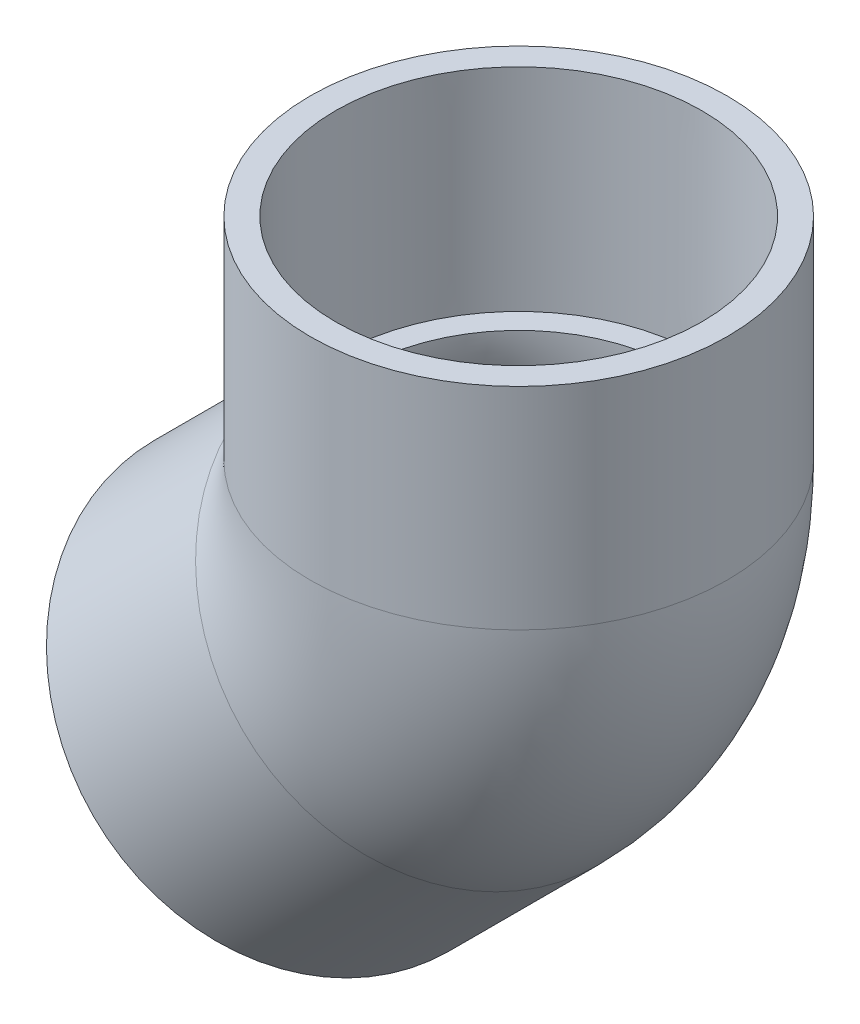
ISO-10303-21;
HEADER;
FILE_DESCRIPTION(('STEP AP214'),'2;1');
FILE_NAME('part.step','',(''),(''),'','','');
FILE_SCHEMA(('AUTOMOTIVE_DESIGN { 1 0 10303 214 1 1 1 1 }'));
ENDSEC;
DATA;
#1=APPLICATION_CONTEXT('core data for automotive mechanical design processes');
#2=APPLICATION_PROTOCOL_DEFINITION('international standard','automotive_design',2000,#1);
#3=PRODUCT_CONTEXT('',#1,'mechanical');
#4=PRODUCT('Part','Part','',(#3));
#5=PRODUCT_RELATED_PRODUCT_CATEGORY('part','',(#4));
#6=PRODUCT_DEFINITION_FORMATION('','',#4);
#7=PRODUCT_DEFINITION_CONTEXT('part definition',#1,'design');
#8=PRODUCT_DEFINITION('design','',#6,#7);
#9=PRODUCT_DEFINITION_SHAPE('','',#8);
#10=(LENGTH_UNIT() NAMED_UNIT(*) SI_UNIT(.MILLI.,.METRE.));
#11=(NAMED_UNIT(*) PLANE_ANGLE_UNIT() SI_UNIT($,.RADIAN.));
#12=(NAMED_UNIT(*) SI_UNIT($,.STERADIAN.) SOLID_ANGLE_UNIT());
#13=UNCERTAINTY_MEASURE_WITH_UNIT(LENGTH_MEASURE(1.E-05),#10,'distance_accuracy_value','');
#14=(GEOMETRIC_REPRESENTATION_CONTEXT(3) GLOBAL_UNCERTAINTY_ASSIGNED_CONTEXT((#13)) GLOBAL_UNIT_ASSIGNED_CONTEXT((#10,
#11,#12)) REPRESENTATION_CONTEXT('',''));
#15=CARTESIAN_POINT('',(0.,0.,0.));
#16=DIRECTION('',(0.,0.,1.));
#17=DIRECTION('',(1.,0.,0.));
#18=AXIS2_PLACEMENT_3D('',#15,#16,#17);
#19=CARTESIAN_POINT('',(-11.50595315512,-60.3360958134333,0.));
#20=DIRECTION('',(-0.707106781186549,-0.707106781186546,0.));
#21=DIRECTION('',(0.707106781186546,-0.707106781186549,0.));
#22=AXIS2_PLACEMENT_3D('',#19,#20,#21);
#23=PLANE('',#22);
#24=CARTESIAN_POINT('',(-35.9210244842767,-35.9210244842766,0.));
#25=DIRECTION('',(-0.707106781186549,-0.707106781186546,0.));
#26=DIRECTION('',(0.707106781186546,-0.707106781186549,0.));
#27=AXIS2_PLACEMENT_3D('',#24,#25,#26);
#28=CIRCLE('',#27,34.528125);
#29=CARTESIAN_POINT('',(-11.50595315512,-60.3360958134333,0.));
#30=VERTEX_POINT('',#29);
#31=EDGE_CURVE('E62',#30,#30,#28,.T.);
#32=ORIENTED_EDGE('',*,*,#31,.T.);
#33=EDGE_LOOP('',(#32));
#34=FACE_BOUND('',#33,.T.);
#35=CARTESIAN_POINT('',(-35.9210244842767,-35.9210244842766,0.));
#36=DIRECTION('',(-0.707106781186549,-0.707106781186546,0.));
#37=DIRECTION('',(0.707106781186546,-0.707106781186549,0.));
#38=AXIS2_PLACEMENT_3D('',#35,#36,#37);
#39=CIRCLE('',#38,30.3149);
#40=CARTESIAN_POINT('',(-14.4851531232846,-57.3568958452686,0.));
#41=VERTEX_POINT('',#40);
#42=EDGE_CURVE('E46',#41,#41,#39,.T.);
#43=ORIENTED_EDGE('',*,*,#42,.F.);
#44=EDGE_LOOP('',(#43));
#45=FACE_BOUND('',#44,.T.);
#46=ADVANCED_FACE('F39',(#34,#45),#23,.T.);
#47=CARTESIAN_POINT('',(-11.2253201513365,-11.2253201513364,0.));
#48=DIRECTION('',(-0.707106781186549,-0.707106781186546,0.));
#49=DIRECTION('',(0.707106781186546,-0.707106781186549,0.));
#50=AXIS2_PLACEMENT_3D('',#47,#48,#49);
#51=CONICAL_SURFACE('',#50,30.0863,0.00654536107227494);
#52=ORIENTED_EDGE('',*,*,#42,.T.);
#53=EDGE_LOOP('',(#52));
#54=FACE_BOUND('',#53,.T.);
#55=CARTESIAN_POINT('',(-11.2253201513365,-11.2253201513364,0.));
#56=DIRECTION('',(-0.707106781186549,-0.707106781186546,0.));
#57=DIRECTION('',(0.707106781186546,-0.707106781186549,0.));
#58=AXIS2_PLACEMENT_3D('',#55,#56,#57);
#59=CIRCLE('',#58,30.0863);
#60=CARTESIAN_POINT('',(10.0489065994763,-32.4995469021493,0.));
#61=VERTEX_POINT('',#60);
#62=EDGE_CURVE('E51',#61,#61,#59,.T.);
#63=ORIENTED_EDGE('',*,*,#62,.F.);
#64=EDGE_LOOP('',(#63));
#65=FACE_BOUND('',#64,.T.);
#66=ADVANCED_FACE('F100',(#54,#65),#51,.F.);
#67=CARTESIAN_POINT('',(-35.9210244842767,-35.9210244842766,0.));
#68=DIRECTION('',(-0.707106781186549,-0.707106781186546,0.));
#69=DIRECTION('',(0.707106781186546,-0.707106781186549,0.));
#70=AXIS2_PLACEMENT_3D('',#67,#68,#69);
#71=CYLINDRICAL_SURFACE('',#70,34.528125);
#72=CARTESIAN_POINT('',(-11.2253201513365,-11.2253201513364,0.));
#73=DIRECTION('',(-0.707106781186549,-0.707106781186546,0.));
#74=DIRECTION('',(0.707106781186546,-0.707106781186549,0.));
#75=AXIS2_PLACEMENT_3D('',#72,#73,#74);
#76=CIRCLE('',#75,34.528125);
#77=CARTESIAN_POINT('',(13.1897511778203,-35.6403914804932,0.));
#78=VERTEX_POINT('',#77);
#79=EDGE_CURVE('E56',#78,#78,#76,.T.);
#80=ORIENTED_EDGE('',*,*,#79,.T.);
#81=EDGE_LOOP('',(#80));
#82=FACE_BOUND('',#81,.T.);
#83=ORIENTED_EDGE('',*,*,#31,.F.);
#84=EDGE_LOOP('',(#83));
#85=FACE_BOUND('',#84,.T.);
#86=ADVANCED_FACE('F105',(#82,#85),#71,.T.);
#87=CARTESIAN_POINT('',(-38.3256403026728,15.875,0.));
#88=DIRECTION('',(0.,0.,-1.));
#89=DIRECTION('',(-1.,0.,0.));
#90=AXIS2_PLACEMENT_3D('',#87,#88,#89);
#91=TOROIDAL_SURFACE('',#90,38.3256403026728,26.2509);
#92=CARTESIAN_POINT('',(0.,15.875,0.));
#93=DIRECTION('',(0.,1.,0.));
#94=DIRECTION('',(-1.,0.,0.));
#95=AXIS2_PLACEMENT_3D('',#92,#93,#94);
#96=CIRCLE('',#95,26.2509);
#97=CARTESIAN_POINT('',(26.2509,15.875,0.));
#98=VERTEX_POINT('',#97);
#99=EDGE_CURVE('E70',#98,#98,#96,.T.);
#100=CARTESIAN_POINT('',(-11.2253201513365,-11.2253201513364,0.));
#101=DIRECTION('',(0.707106781186549,0.707106781186546,0.));
#102=DIRECTION('',(-0.707106781186546,0.707106781186549,0.));
#103=AXIS2_PLACEMENT_3D('',#100,#101,#102);
#104=CIRCLE('',#103,26.2509);
#105=CARTESIAN_POINT('',(7.33686925091345,-29.7875095535864,0.));
#106=VERTEX_POINT('',#105);
#107=EDGE_CURVE('E74',#106,#106,#104,.T.);
#108=CARTESIAN_POINT('',(-38.3256403026728,15.875,0.));
#109=DIRECTION('',(0.,0.,-1.));
#110=DIRECTION('',(-1.,0.,0.));
#111=AXIS2_PLACEMENT_3D('',#108,#109,#110);
#112=CIRCLE('',#111,64.5765403026728);
#113=EDGE_CURVE('',#98,#106,#112,.T.);
#114=ORIENTED_EDGE('',*,*,#99,.T.);
#115=ORIENTED_EDGE('',*,*,#107,.F.);
#116=ORIENTED_EDGE('',*,*,#113,.T.);
#117=ORIENTED_EDGE('',*,*,#113,.F.);
#118=EDGE_LOOP('',(#114,#116,#115,#117));
#119=FACE_BOUND('',#118,.T.);
#120=ADVANCED_FACE('F110',(#119),#91,.F.);
#121=CARTESIAN_POINT('',(-38.3256403026728,15.875,0.));
#122=DIRECTION('',(0.,0.,-1.));
#123=DIRECTION('',(-1.,0.,0.));
#124=AXIS2_PLACEMENT_3D('',#121,#122,#123);
#125=TOROIDAL_SURFACE('',#124,38.3256403026728,34.528125);
#126=CARTESIAN_POINT('',(0.,15.875,0.));
#127=DIRECTION('',(0.,1.,0.));
#128=DIRECTION('',(-1.,0.,0.));
#129=AXIS2_PLACEMENT_3D('',#126,#127,#128);
#130=CIRCLE('',#129,34.528125);
#131=CARTESIAN_POINT('',(34.528125,15.875,0.));
#132=VERTEX_POINT('',#131);
#133=EDGE_CURVE('E66',#132,#132,#130,.T.);
#134=CARTESIAN_POINT('',(-38.3256403026728,15.875,0.));
#135=DIRECTION('',(0.,0.,-1.));
#136=DIRECTION('',(-1.,0.,0.));
#137=AXIS2_PLACEMENT_3D('',#134,#135,#136);
#138=CIRCLE('',#137,72.8537653026728);
#139=EDGE_CURVE('',#132,#78,#138,.T.);
#140=ORIENTED_EDGE('',*,*,#133,.F.);
#141=ORIENTED_EDGE('',*,*,#79,.F.);
#142=ORIENTED_EDGE('',*,*,#139,.T.);
#143=ORIENTED_EDGE('',*,*,#139,.F.);
#144=EDGE_LOOP('',(#140,#142,#141,#143));
#145=FACE_BOUND('',#144,.T.);
#146=ADVANCED_FACE('F116',(#145),#125,.T.);
#147=CARTESIAN_POINT('',(0.,15.875,0.));
#148=DIRECTION('',(0.,1.,0.));
#149=DIRECTION('',(-1.,0.,0.));
#150=AXIS2_PLACEMENT_3D('',#147,#148,#149);
#151=PLANE('',#150);
#152=CARTESIAN_POINT('',(0.,15.875,0.));
#153=DIRECTION('',(0.,1.,0.));
#154=DIRECTION('',(-1.,0.,0.));
#155=AXIS2_PLACEMENT_3D('',#152,#153,#154);
#156=CIRCLE('',#155,30.0863);
#157=CARTESIAN_POINT('',(-30.0863,15.875,0.));
#158=VERTEX_POINT('',#157);
#159=EDGE_CURVE('E10',#158,#158,#156,.F.);
#160=ORIENTED_EDGE('',*,*,#159,.F.);
#161=EDGE_LOOP('',(#160));
#162=FACE_BOUND('',#161,.T.);
#163=ORIENTED_EDGE('',*,*,#99,.F.);
#164=EDGE_LOOP('',(#163));
#165=FACE_BOUND('',#164,.T.);
#166=ADVANCED_FACE('F121',(#162,#165),#151,.T.);
#167=CARTESIAN_POINT('',(-11.2253201513365,-11.2253201513364,0.));
#168=DIRECTION('',(0.707106781186549,0.707106781186546,0.));
#169=DIRECTION('',(-0.707106781186546,0.707106781186549,0.));
#170=AXIS2_PLACEMENT_3D('',#167,#168,#169);
#171=PLANE('',#170);
#172=ORIENTED_EDGE('',*,*,#62,.T.);
#173=EDGE_LOOP('',(#172));
#174=FACE_BOUND('',#173,.T.);
#175=ORIENTED_EDGE('',*,*,#107,.T.);
#176=EDGE_LOOP('',(#175));
#177=FACE_BOUND('',#176,.T.);
#178=ADVANCED_FACE('F126',(#174,#177),#171,.F.);
#179=CARTESIAN_POINT('',(34.528125,50.8,0.));
#180=DIRECTION('',(0.,1.,0.));
#181=DIRECTION('',(0.,0.,1.));
#182=AXIS2_PLACEMENT_3D('',#179,#180,#181);
#183=PLANE('',#182);
#184=CARTESIAN_POINT('',(0.,50.8,0.));
#185=DIRECTION('',(0.,-1.,0.));
#186=DIRECTION('',(0.,0.,-1.));
#187=AXIS2_PLACEMENT_3D('',#184,#185,#186);
#188=CIRCLE('',#187,30.3149);
#189=CARTESIAN_POINT('',(0.,50.8,-30.3149));
#190=VERTEX_POINT('',#189);
#191=EDGE_CURVE('E82',#190,#190,#188,.T.);
#192=ORIENTED_EDGE('',*,*,#191,.T.);
#193=EDGE_LOOP('',(#192));
#194=FACE_BOUND('',#193,.T.);
#195=CARTESIAN_POINT('',(0.,50.8,0.));
#196=DIRECTION('',(0.,-1.,0.));
#197=DIRECTION('',(0.,0.,-1.));
#198=AXIS2_PLACEMENT_3D('',#195,#196,#197);
#199=CIRCLE('',#198,34.528125);
#200=CARTESIAN_POINT('',(0.,50.8,-34.528125));
#201=VERTEX_POINT('',#200);
#202=EDGE_CURVE('E78',#201,#201,#199,.T.);
#203=ORIENTED_EDGE('',*,*,#202,.F.);
#204=EDGE_LOOP('',(#203));
#205=FACE_BOUND('',#204,.T.);
#206=ADVANCED_FACE('F87',(#194,#205),#183,.T.);
#207=CARTESIAN_POINT('',(0.,0.,0.));
#208=DIRECTION('',(0.,-1.,0.));
#209=DIRECTION('',(0.,0.,-1.));
#210=AXIS2_PLACEMENT_3D('',#207,#208,#209);
#211=CYLINDRICAL_SURFACE('',#210,34.528125);
#212=ORIENTED_EDGE('',*,*,#202,.T.);
#213=EDGE_LOOP('',(#212));
#214=FACE_BOUND('',#213,.T.);
#215=ORIENTED_EDGE('',*,*,#133,.T.);
#216=EDGE_LOOP('',(#215));
#217=FACE_BOUND('',#216,.T.);
#218=ADVANCED_FACE('F92',(#214,#217),#211,.T.);
#219=CARTESIAN_POINT('',(0.,50.8,0.));
#220=DIRECTION('',(0.,1.,0.));
#221=DIRECTION('',(0.,0.,1.));
#222=AXIS2_PLACEMENT_3D('',#219,#220,#221);
#223=CONICAL_SURFACE('',#222,30.3149,0.00654536107227504);
#224=ORIENTED_EDGE('',*,*,#159,.T.);
#225=EDGE_LOOP('',(#224));
#226=FACE_BOUND('',#225,.T.);
#227=ORIENTED_EDGE('',*,*,#191,.F.);
#228=EDGE_LOOP('',(#227));
#229=FACE_BOUND('',#228,.T.);
#230=ADVANCED_FACE('F90',(#226,#229),#223,.F.);
#231=CLOSED_SHELL('',(#46,#66,#86,#120,#146,#166,#178,#206,#218,#230));
#232=MANIFOLD_SOLID_BREP('B2',#231);
#233=ADVANCED_BREP_SHAPE_REPRESENTATION('',(#18,#232),#14);
#234=SHAPE_DEFINITION_REPRESENTATION(#9,#233);
ENDSEC;
END-ISO-10303-21;
